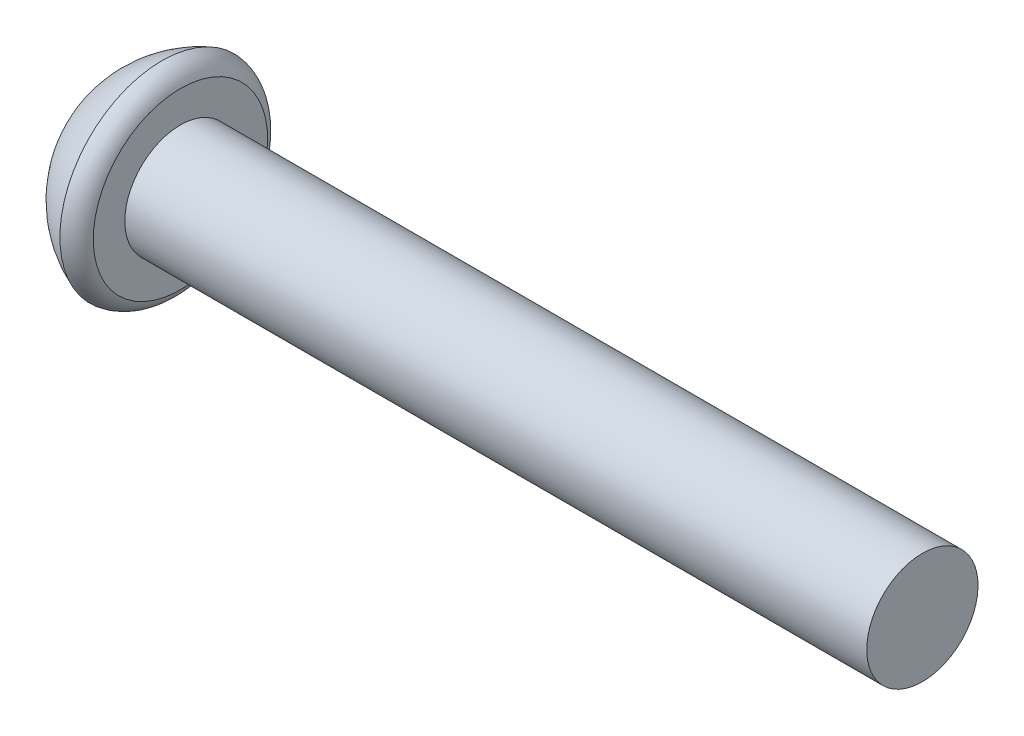
ISO-10303-21;
HEADER;
FILE_DESCRIPTION(('STEP AP214'),'2;1');
FILE_NAME('part.step','',(''),(''),'','','');
FILE_SCHEMA(('AUTOMOTIVE_DESIGN { 1 0 10303 214 1 1 1 1 }'));
ENDSEC;
DATA;
#1=APPLICATION_CONTEXT('core data for automotive mechanical design processes');
#2=APPLICATION_PROTOCOL_DEFINITION('international standard','automotive_design',2000,#1);
#3=PRODUCT_CONTEXT('',#1,'mechanical');
#4=PRODUCT('Part','Part','',(#3));
#5=PRODUCT_RELATED_PRODUCT_CATEGORY('part','',(#4));
#6=PRODUCT_DEFINITION_FORMATION('','',#4);
#7=PRODUCT_DEFINITION_CONTEXT('part definition',#1,'design');
#8=PRODUCT_DEFINITION('design','',#6,#7);
#9=PRODUCT_DEFINITION_SHAPE('','',#8);
#10=(LENGTH_UNIT() NAMED_UNIT(*) SI_UNIT(.MILLI.,.METRE.));
#11=(NAMED_UNIT(*) PLANE_ANGLE_UNIT() SI_UNIT($,.RADIAN.));
#12=(NAMED_UNIT(*) SI_UNIT($,.STERADIAN.) SOLID_ANGLE_UNIT());
#13=UNCERTAINTY_MEASURE_WITH_UNIT(LENGTH_MEASURE(1.E-05),#10,'distance_accuracy_value','');
#14=(GEOMETRIC_REPRESENTATION_CONTEXT(3) GLOBAL_UNCERTAINTY_ASSIGNED_CONTEXT((#13)) GLOBAL_UNIT_ASSIGNED_CONTEXT((#10,
#11,#12)) REPRESENTATION_CONTEXT('',''));
#15=CARTESIAN_POINT('',(0.,0.,0.));
#16=DIRECTION('',(0.,0.,1.));
#17=DIRECTION('',(1.,0.,0.));
#18=AXIS2_PLACEMENT_3D('',#15,#16,#17);
#19=CARTESIAN_POINT('',(0.,0.849999999999998,0.));
#20=DIRECTION('',(1.,0.,0.));
#21=DIRECTION('',(0.,1.,0.));
#22=AXIS2_PLACEMENT_3D('',#19,#20,#21);
#23=PLANE('',#22);
#24=CARTESIAN_POINT('',(0.,-1.5,0.));
#25=DIRECTION('',(1.,0.,0.));
#26=DIRECTION('',(0.,1.,0.));
#27=AXIS2_PLACEMENT_3D('',#24,#25,#26);
#28=CIRCLE('',#27,2.35);
#29=CARTESIAN_POINT('',(0.,0.849999999999998,0.));
#30=VERTEX_POINT('',#29);
#31=EDGE_CURVE('E159',#30,#30,#28,.T.);
#32=ORIENTED_EDGE('',*,*,#31,.T.);
#33=EDGE_LOOP('',(#32));
#34=FACE_BOUND('',#33,.T.);
#35=CARTESIAN_POINT('',(0.,-1.5,0.));
#36=DIRECTION('',(1.,0.,0.));
#37=DIRECTION('',(0.,1.,0.));
#38=AXIS2_PLACEMENT_3D('',#35,#36,#37);
#39=CIRCLE('',#38,1.5);
#40=CARTESIAN_POINT('',(0.,0.,0.));
#41=VERTEX_POINT('',#40);
#42=EDGE_CURVE('E11',#41,#41,#39,.T.);
#43=ORIENTED_EDGE('',*,*,#42,.F.);
#44=EDGE_LOOP('',(#43));
#45=FACE_BOUND('',#44,.T.);
#46=ADVANCED_FACE('F45',(#34,#45),#23,.T.);
#47=CARTESIAN_POINT('',(20.,-1.5,0.));
#48=DIRECTION('',(1.,0.,0.));
#49=DIRECTION('',(0.,1.,0.));
#50=AXIS2_PLACEMENT_3D('',#47,#48,#49);
#51=CYLINDRICAL_SURFACE('',#50,1.5);
#52=ORIENTED_EDGE('',*,*,#42,.T.);
#53=EDGE_LOOP('',(#52));
#54=FACE_BOUND('',#53,.T.);
#55=CARTESIAN_POINT('',(20.,-1.5,0.));
#56=DIRECTION('',(1.,0.,0.));
#57=DIRECTION('',(0.,1.,0.));
#58=AXIS2_PLACEMENT_3D('',#55,#56,#57);
#59=CIRCLE('',#58,1.5);
#60=CARTESIAN_POINT('',(20.,0.,0.));
#61=VERTEX_POINT('',#60);
#62=EDGE_CURVE('E53',#61,#61,#59,.T.);
#63=ORIENTED_EDGE('',*,*,#62,.F.);
#64=EDGE_LOOP('',(#63));
#65=FACE_BOUND('',#64,.T.);
#66=ADVANCED_FACE('F185',(#54,#65),#51,.T.);
#67=CARTESIAN_POINT('',(20.,0.,0.));
#68=DIRECTION('',(1.,0.,0.));
#69=DIRECTION('',(0.,1.,0.));
#70=AXIS2_PLACEMENT_3D('',#67,#68,#69);
#71=PLANE('',#70);
#72=ORIENTED_EDGE('',*,*,#62,.T.);
#73=EDGE_LOOP('',(#72));
#74=FACE_BOUND('',#73,.T.);
#75=ADVANCED_FACE('F183',(#74),#71,.T.);
#76=CARTESIAN_POINT('',(-2.,-1.5,0.));
#77=DIRECTION('',(-1.,0.,0.));
#78=DIRECTION('',(0.,-1.,0.));
#79=AXIS2_PLACEMENT_3D('',#76,#77,#78);
#80=PLANE('',#79);
#81=DIRECTION('',(0.,0.5,-0.866025403784438));
#82=VECTOR('',#81,1.);
#83=CARTESIAN_POINT('',(-2.,-0.864914703891413,1.1));
#84=LINE('',#83,#82);
#85=CARTESIAN_POINT('',(-2.,-0.864914703891413,1.1));
#86=VERTEX_POINT('',#85);
#87=CARTESIAN_POINT('',(-2.,-0.229829407782825,0.));
#88=VERTEX_POINT('',#87);
#89=EDGE_CURVE('E60',#86,#88,#84,.T.);
#90=ORIENTED_EDGE('',*,*,#89,.F.);
#91=DIRECTION('',(0.,1.,0.));
#92=VECTOR('',#91,1.);
#93=CARTESIAN_POINT('',(-2.,-2.13508529610859,1.1));
#94=LINE('',#93,#92);
#95=CARTESIAN_POINT('',(-2.,-2.13508529610859,1.1));
#96=VERTEX_POINT('',#95);
#97=EDGE_CURVE('E153',#96,#86,#94,.T.);
#98=ORIENTED_EDGE('',*,*,#97,.F.);
#99=DIRECTION('',(0.,0.5,0.866025403784439));
#100=VECTOR('',#99,1.);
#101=CARTESIAN_POINT('',(-2.,-2.77017059221718,0.));
#102=LINE('',#101,#100);
#103=CARTESIAN_POINT('',(-2.,-2.77017059221718,0.));
#104=VERTEX_POINT('',#103);
#105=EDGE_CURVE('E150',#104,#96,#102,.T.);
#106=ORIENTED_EDGE('',*,*,#105,.F.);
#107=DIRECTION('',(0.,-0.5,0.866025403784439));
#108=VECTOR('',#107,1.);
#109=CARTESIAN_POINT('',(-2.,-2.13508529610859,-1.1));
#110=LINE('',#109,#108);
#111=CARTESIAN_POINT('',(-2.,-2.13508529610859,-1.1));
#112=VERTEX_POINT('',#111);
#113=EDGE_CURVE('E108',#112,#104,#110,.T.);
#114=ORIENTED_EDGE('',*,*,#113,.F.);
#115=DIRECTION('',(0.,-1.,0.));
#116=VECTOR('',#115,1.);
#117=CARTESIAN_POINT('',(-2.,-0.864914703891413,-1.1));
#118=LINE('',#117,#116);
#119=CARTESIAN_POINT('',(-2.,-0.864914703891413,-1.1));
#120=VERTEX_POINT('',#119);
#121=EDGE_CURVE('E144',#120,#112,#118,.T.);
#122=ORIENTED_EDGE('',*,*,#121,.F.);
#123=DIRECTION('',(0.,-0.5,-0.866025403784439));
#124=VECTOR('',#123,1.);
#125=CARTESIAN_POINT('',(-2.,-0.229829407782825,0.));
#126=LINE('',#125,#124);
#127=EDGE_CURVE('E140',#88,#120,#126,.T.);
#128=ORIENTED_EDGE('',*,*,#127,.F.);
#129=EDGE_LOOP('',(#90,#98,#106,#114,#122,#128));
#130=FACE_BOUND('',#129,.T.);
#131=CARTESIAN_POINT('',(-2.,-1.5,0.));
#132=DIRECTION('',(1.,0.,0.));
#133=DIRECTION('',(0.,1.,0.));
#134=AXIS2_PLACEMENT_3D('',#131,#132,#133);
#135=CIRCLE('',#134,1.5);
#136=CARTESIAN_POINT('',(-2.,0.,0.));
#137=VERTEX_POINT('',#136);
#138=EDGE_CURVE('E176',#137,#137,#135,.T.);
#139=ORIENTED_EDGE('',*,*,#138,.F.);
#140=EDGE_LOOP('',(#139));
#141=FACE_BOUND('',#140,.T.);
#142=ADVANCED_FACE('F192',(#130,#141),#80,.T.);
#143=CARTESIAN_POINT('',(0.538908793687131,-1.5,0.));
#144=DIRECTION('',(1.,0.,0.));
#145=DIRECTION('',(0.,1.,0.));
#146=AXIS2_PLACEMENT_3D('',#143,#144,#145);
#147=DEGENERATE_TOROIDAL_SURFACE('',#146,0.0216905524245582,2.96,.F.);
#148=ORIENTED_EDGE('',*,*,#138,.T.);
#149=EDGE_LOOP('',(#148));
#150=FACE_BOUND('',#149,.T.);
#151=CARTESIAN_POINT('',(-0.5,-1.5,0.));
#152=DIRECTION('',(1.,0.,0.));
#153=DIRECTION('',(0.,1.,0.));
#154=AXIS2_PLACEMENT_3D('',#151,#152,#153);
#155=CIRCLE('',#154,2.75);
#156=CARTESIAN_POINT('',(-0.500000000000001,1.25,0.));
#157=VERTEX_POINT('',#156);
#158=EDGE_CURVE('E172',#157,#157,#155,.T.);
#159=ORIENTED_EDGE('',*,*,#158,.F.);
#160=EDGE_LOOP('',(#159));
#161=FACE_BOUND('',#160,.T.);
#162=ADVANCED_FACE('F198',(#150,#161),#147,.F.);
#163=CARTESIAN_POINT('',(-0.566998114943999,-1.5,0.));
#164=DIRECTION('',(1.,0.,0.));
#165=DIRECTION('',(0.,1.,0.));
#166=AXIS2_PLACEMENT_3D('',#163,#164,#165);
#167=TOROIDAL_SURFACE('',#166,2.15375235632,0.6);
#168=ORIENTED_EDGE('',*,*,#158,.T.);
#169=EDGE_LOOP('',(#168));
#170=FACE_BOUND('',#169,.T.);
#171=ORIENTED_EDGE('',*,*,#31,.F.);
#172=EDGE_LOOP('',(#171));
#173=FACE_BOUND('',#172,.T.);
#174=ADVANCED_FACE('F202',(#170,#173),#167,.T.);
#175=CARTESIAN_POINT('',(-0.5,-0.864914703891413,1.1));
#176=DIRECTION('',(0.,0.866025403784439,0.5));
#177=DIRECTION('',(0.,-0.5,0.866025403784439));
#178=AXIS2_PLACEMENT_3D('',#175,#176,#177);
#179=PLANE('',#178);
#180=ORIENTED_EDGE('',*,*,#89,.T.);
#181=DIRECTION('',(-1.,0.,0.));
#182=VECTOR('',#181,1.);
#183=CARTESIAN_POINT('',(-0.5,-0.229829407782825,0.));
#184=LINE('',#183,#182);
#185=CARTESIAN_POINT('',(-0.5,-0.229829407782825,0.));
#186=VERTEX_POINT('',#185);
#187=EDGE_CURVE('E90',#186,#88,#184,.T.);
#188=ORIENTED_EDGE('',*,*,#187,.F.);
#189=DIRECTION('',(0.,0.5,-0.866025403784438));
#190=VECTOR('',#189,1.);
#191=CARTESIAN_POINT('',(-0.5,-0.864914703891413,1.1));
#192=LINE('',#191,#190);
#193=CARTESIAN_POINT('',(-0.5,-0.864914703891413,1.1));
#194=VERTEX_POINT('',#193);
#195=EDGE_CURVE('E156',#194,#186,#192,.T.);
#196=ORIENTED_EDGE('',*,*,#195,.F.);
#197=DIRECTION('',(-1.,0.,0.));
#198=VECTOR('',#197,1.);
#199=CARTESIAN_POINT('',(-0.5,-0.864914703891413,1.1));
#200=LINE('',#199,#198);
#201=EDGE_CURVE('E68',#194,#86,#200,.T.);
#202=ORIENTED_EDGE('',*,*,#201,.T.);
#203=EDGE_LOOP('',(#180,#188,#196,#202));
#204=FACE_BOUND('',#203,.T.);
#205=ADVANCED_FACE('F206',(#204),#179,.F.);
#206=CARTESIAN_POINT('',(-0.5,-2.13508529610859,1.1));
#207=DIRECTION('',(0.,0.,1.));
#208=DIRECTION('',(0.,-1.,0.));
#209=AXIS2_PLACEMENT_3D('',#206,#207,#208);
#210=PLANE('',#209);
#211=ORIENTED_EDGE('',*,*,#97,.T.);
#212=ORIENTED_EDGE('',*,*,#201,.F.);
#213=DIRECTION('',(0.,1.,0.));
#214=VECTOR('',#213,1.);
#215=CARTESIAN_POINT('',(-0.5,-2.13508529610859,1.1));
#216=LINE('',#215,#214);
#217=CARTESIAN_POINT('',(-0.5,-2.13508529610859,1.1));
#218=VERTEX_POINT('',#217);
#219=EDGE_CURVE('E122',#218,#194,#216,.T.);
#220=ORIENTED_EDGE('',*,*,#219,.F.);
#221=DIRECTION('',(-1.,0.,0.));
#222=VECTOR('',#221,1.);
#223=CARTESIAN_POINT('',(-0.5,-2.13508529610859,1.1));
#224=LINE('',#223,#222);
#225=EDGE_CURVE('E113',#218,#96,#224,.T.);
#226=ORIENTED_EDGE('',*,*,#225,.T.);
#227=EDGE_LOOP('',(#211,#212,#220,#226));
#228=FACE_BOUND('',#227,.T.);
#229=ADVANCED_FACE('F210',(#228),#210,.F.);
#230=CARTESIAN_POINT('',(-0.5,-2.77017059221718,0.));
#231=DIRECTION('',(0.,-0.866025403784439,0.5));
#232=DIRECTION('',(0.,-0.5,-0.866025403784439));
#233=AXIS2_PLACEMENT_3D('',#230,#231,#232);
#234=PLANE('',#233);
#235=ORIENTED_EDGE('',*,*,#105,.T.);
#236=ORIENTED_EDGE('',*,*,#225,.F.);
#237=DIRECTION('',(0.,0.5,0.866025403784439));
#238=VECTOR('',#237,1.);
#239=CARTESIAN_POINT('',(-0.5,-2.77017059221718,0.));
#240=LINE('',#239,#238);
#241=CARTESIAN_POINT('',(-0.5,-2.77017059221718,0.));
#242=VERTEX_POINT('',#241);
#243=EDGE_CURVE('E117',#242,#218,#240,.T.);
#244=ORIENTED_EDGE('',*,*,#243,.F.);
#245=DIRECTION('',(-1.,0.,0.));
#246=VECTOR('',#245,1.);
#247=CARTESIAN_POINT('',(-0.5,-2.77017059221718,0.));
#248=LINE('',#247,#246);
#249=EDGE_CURVE('E101',#242,#104,#248,.T.);
#250=ORIENTED_EDGE('',*,*,#249,.T.);
#251=EDGE_LOOP('',(#235,#236,#244,#250));
#252=FACE_BOUND('',#251,.T.);
#253=ADVANCED_FACE('F118',(#252),#234,.F.);
#254=CARTESIAN_POINT('',(-0.5,-2.13508529610859,-1.1));
#255=DIRECTION('',(0.,-0.866025403784439,-0.5));
#256=DIRECTION('',(0.,0.5,-0.866025403784439));
#257=AXIS2_PLACEMENT_3D('',#254,#255,#256);
#258=PLANE('',#257);
#259=ORIENTED_EDGE('',*,*,#113,.T.);
#260=ORIENTED_EDGE('',*,*,#249,.F.);
#261=DIRECTION('',(0.,-0.5,0.866025403784439));
#262=VECTOR('',#261,1.);
#263=CARTESIAN_POINT('',(-0.5,-2.13508529610859,-1.1));
#264=LINE('',#263,#262);
#265=CARTESIAN_POINT('',(-0.5,-2.13508529610859,-1.1));
#266=VERTEX_POINT('',#265);
#267=EDGE_CURVE('E105',#266,#242,#264,.T.);
#268=ORIENTED_EDGE('',*,*,#267,.F.);
#269=DIRECTION('',(-1.,0.,0.));
#270=VECTOR('',#269,1.);
#271=CARTESIAN_POINT('',(-0.5,-2.13508529610859,-1.1));
#272=LINE('',#271,#270);
#273=EDGE_CURVE('E114',#266,#112,#272,.T.);
#274=ORIENTED_EDGE('',*,*,#273,.T.);
#275=EDGE_LOOP('',(#259,#260,#268,#274));
#276=FACE_BOUND('',#275,.T.);
#277=ADVANCED_FACE('F103',(#276),#258,.F.);
#278=CARTESIAN_POINT('',(-0.5,-0.864914703891413,-1.1));
#279=DIRECTION('',(0.,0.,-1.));
#280=DIRECTION('',(0.,1.,0.));
#281=AXIS2_PLACEMENT_3D('',#278,#279,#280);
#282=PLANE('',#281);
#283=ORIENTED_EDGE('',*,*,#121,.T.);
#284=ORIENTED_EDGE('',*,*,#273,.F.);
#285=DIRECTION('',(0.,-1.,0.));
#286=VECTOR('',#285,1.);
#287=CARTESIAN_POINT('',(-0.5,-0.864914703891413,-1.1));
#288=LINE('',#287,#286);
#289=CARTESIAN_POINT('',(-0.5,-0.864914703891413,-1.1));
#290=VERTEX_POINT('',#289);
#291=EDGE_CURVE('E128',#290,#266,#288,.T.);
#292=ORIENTED_EDGE('',*,*,#291,.F.);
#293=DIRECTION('',(-1.,0.,0.));
#294=VECTOR('',#293,1.);
#295=CARTESIAN_POINT('',(-0.5,-0.864914703891413,-1.1));
#296=LINE('',#295,#294);
#297=EDGE_CURVE('E164',#290,#120,#296,.T.);
#298=ORIENTED_EDGE('',*,*,#297,.T.);
#299=EDGE_LOOP('',(#283,#284,#292,#298));
#300=FACE_BOUND('',#299,.T.);
#301=ADVANCED_FACE('F214',(#300),#282,.F.);
#302=CARTESIAN_POINT('',(-0.5,-0.229829407782825,0.));
#303=DIRECTION('',(0.,0.866025403784439,-0.5));
#304=DIRECTION('',(0.,0.5,0.866025403784439));
#305=AXIS2_PLACEMENT_3D('',#302,#303,#304);
#306=PLANE('',#305);
#307=ORIENTED_EDGE('',*,*,#127,.T.);
#308=ORIENTED_EDGE('',*,*,#297,.F.);
#309=DIRECTION('',(0.,-0.5,-0.866025403784439));
#310=VECTOR('',#309,1.);
#311=CARTESIAN_POINT('',(-0.5,-0.229829407782825,0.));
#312=LINE('',#311,#310);
#313=EDGE_CURVE('E132',#186,#290,#312,.T.);
#314=ORIENTED_EDGE('',*,*,#313,.F.);
#315=ORIENTED_EDGE('',*,*,#187,.T.);
#316=EDGE_LOOP('',(#307,#308,#314,#315));
#317=FACE_BOUND('',#316,.T.);
#318=ADVANCED_FACE('F211',(#317),#306,.F.);
#319=CARTESIAN_POINT('',(-0.5,0.,0.));
#320=DIRECTION('',(-1.,0.,0.));
#321=DIRECTION('',(0.,0.,1.));
#322=AXIS2_PLACEMENT_3D('',#319,#320,#321);
#323=PLANE('',#322);
#324=ORIENTED_EDGE('',*,*,#195,.T.);
#325=ORIENTED_EDGE('',*,*,#313,.T.);
#326=ORIENTED_EDGE('',*,*,#291,.T.);
#327=ORIENTED_EDGE('',*,*,#267,.T.);
#328=ORIENTED_EDGE('',*,*,#243,.T.);
#329=ORIENTED_EDGE('',*,*,#219,.T.);
#330=EDGE_LOOP('',(#324,#325,#326,#327,#328,#329));
#331=FACE_BOUND('',#330,.T.);
#332=ADVANCED_FACE('F125',(#331),#323,.T.);
#333=CLOSED_SHELL('',(#46,#66,#75,#142,#162,#174,#205,#229,#253,#277,#301,#318,#332));
#334=MANIFOLD_SOLID_BREP('B2',#333);
#335=ADVANCED_BREP_SHAPE_REPRESENTATION('',(#18,#334),#14);
#336=SHAPE_DEFINITION_REPRESENTATION(#9,#335);
ENDSEC;
END-ISO-10303-21;
